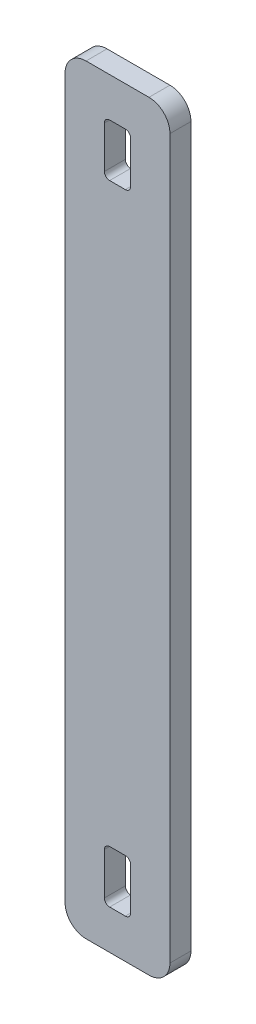
ISO-10303-21;
HEADER;
FILE_DESCRIPTION(('STEP AP214'),'2;1');
FILE_NAME('part.step','',(''),(''),'','','');
FILE_SCHEMA(('AUTOMOTIVE_DESIGN { 1 0 10303 214 1 1 1 1 }'));
ENDSEC;
DATA;
#1=APPLICATION_CONTEXT('core data for automotive mechanical design processes');
#2=APPLICATION_PROTOCOL_DEFINITION('international standard','automotive_design',2000,#1);
#3=PRODUCT_CONTEXT('',#1,'mechanical');
#4=PRODUCT('Part','Part','',(#3));
#5=PRODUCT_RELATED_PRODUCT_CATEGORY('part','',(#4));
#6=PRODUCT_DEFINITION_FORMATION('','',#4);
#7=PRODUCT_DEFINITION_CONTEXT('part definition',#1,'design');
#8=PRODUCT_DEFINITION('design','',#6,#7);
#9=PRODUCT_DEFINITION_SHAPE('','',#8);
#10=(LENGTH_UNIT() NAMED_UNIT(*) SI_UNIT(.MILLI.,.METRE.));
#11=(NAMED_UNIT(*) PLANE_ANGLE_UNIT() SI_UNIT($,.RADIAN.));
#12=(NAMED_UNIT(*) SI_UNIT($,.STERADIAN.) SOLID_ANGLE_UNIT());
#13=UNCERTAINTY_MEASURE_WITH_UNIT(LENGTH_MEASURE(1.E-05),#10,'distance_accuracy_value','');
#14=(GEOMETRIC_REPRESENTATION_CONTEXT(3) GLOBAL_UNCERTAINTY_ASSIGNED_CONTEXT((#13)) GLOBAL_UNIT_ASSIGNED_CONTEXT((#10,
#11,#12)) REPRESENTATION_CONTEXT('',''));
#15=CARTESIAN_POINT('',(0.,0.,0.));
#16=DIRECTION('',(0.,0.,1.));
#17=DIRECTION('',(1.,0.,0.));
#18=AXIS2_PLACEMENT_3D('',#15,#16,#17);
#19=CARTESIAN_POINT('',(-6.,-68.5,4.));
#20=DIRECTION('',(0.,0.,-1.));
#21=DIRECTION('',(-1.,0.,0.));
#22=AXIS2_PLACEMENT_3D('',#19,#20,#21);
#23=CYLINDRICAL_SURFACE('',#22,4.);
#24=CARTESIAN_POINT('',(-6.,-68.5,0.));
#25=DIRECTION('',(0.,0.,1.));
#26=DIRECTION('',(-1.,0.,0.));
#27=AXIS2_PLACEMENT_3D('',#24,#25,#26);
#28=CIRCLE('',#27,4.);
#29=CARTESIAN_POINT('',(-10.,-68.5,0.));
#30=VERTEX_POINT('',#29);
#31=CARTESIAN_POINT('',(-6.,-72.5,0.));
#32=VERTEX_POINT('',#31);
#33=EDGE_CURVE('E256',#30,#32,#28,.T.);
#34=ORIENTED_EDGE('',*,*,#33,.T.);
#35=DIRECTION('',(0.,0.,-1.));
#36=VECTOR('',#35,1.);
#37=CARTESIAN_POINT('',(-6.,-72.5,4.));
#38=LINE('',#37,#36);
#39=CARTESIAN_POINT('',(-6.,-72.5,4.));
#40=VERTEX_POINT('',#39);
#41=EDGE_CURVE('E11',#40,#32,#38,.T.);
#42=ORIENTED_EDGE('',*,*,#41,.F.);
#43=CARTESIAN_POINT('',(-6.,-68.5,4.));
#44=DIRECTION('',(0.,0.,1.));
#45=DIRECTION('',(-1.,0.,0.));
#46=AXIS2_PLACEMENT_3D('',#43,#44,#45);
#47=CIRCLE('',#46,4.);
#48=CARTESIAN_POINT('',(-10.,-68.5,4.));
#49=VERTEX_POINT('',#48);
#50=EDGE_CURVE('E329',#49,#40,#47,.T.);
#51=ORIENTED_EDGE('',*,*,#50,.F.);
#52=DIRECTION('',(0.,0.,-1.));
#53=VECTOR('',#52,1.);
#54=CARTESIAN_POINT('',(-10.,-68.5,4.));
#55=LINE('',#54,#53);
#56=EDGE_CURVE('E347',#49,#30,#55,.T.);
#57=ORIENTED_EDGE('',*,*,#56,.T.);
#58=EDGE_LOOP('',(#34,#42,#51,#57));
#59=FACE_BOUND('',#58,.T.);
#60=ADVANCED_FACE('F35',(#59),#23,.T.);
#61=CARTESIAN_POINT('',(-6.,-72.5,4.));
#62=DIRECTION('',(0.,1.,0.));
#63=DIRECTION('',(0.,0.,1.));
#64=AXIS2_PLACEMENT_3D('',#61,#62,#63);
#65=PLANE('',#64);
#66=DIRECTION('',(1.,0.,0.));
#67=VECTOR('',#66,1.);
#68=CARTESIAN_POINT('',(-6.,-72.5,0.));
#69=LINE('',#68,#67);
#70=CARTESIAN_POINT('',(6.,-72.5,0.));
#71=VERTEX_POINT('',#70);
#72=EDGE_CURVE('E350',#32,#71,#69,.T.);
#73=ORIENTED_EDGE('',*,*,#72,.T.);
#74=DIRECTION('',(0.,0.,-1.));
#75=VECTOR('',#74,1.);
#76=CARTESIAN_POINT('',(6.,-72.5,4.));
#77=LINE('',#76,#75);
#78=CARTESIAN_POINT('',(6.,-72.5,4.));
#79=VERTEX_POINT('',#78);
#80=EDGE_CURVE('E42',#79,#71,#77,.T.);
#81=ORIENTED_EDGE('',*,*,#80,.F.);
#82=DIRECTION('',(1.,0.,0.));
#83=VECTOR('',#82,1.);
#84=CARTESIAN_POINT('',(-6.,-72.5,4.));
#85=LINE('',#84,#83);
#86=EDGE_CURVE('E332',#40,#79,#85,.T.);
#87=ORIENTED_EDGE('',*,*,#86,.F.);
#88=ORIENTED_EDGE('',*,*,#41,.T.);
#89=EDGE_LOOP('',(#73,#81,#87,#88));
#90=FACE_BOUND('',#89,.T.);
#91=ADVANCED_FACE('F406',(#90),#65,.F.);
#92=CARTESIAN_POINT('',(6.,-68.5,4.));
#93=DIRECTION('',(0.,0.,-1.));
#94=DIRECTION('',(-1.,0.,0.));
#95=AXIS2_PLACEMENT_3D('',#92,#93,#94);
#96=CYLINDRICAL_SURFACE('',#95,4.);
#97=CARTESIAN_POINT('',(6.,-68.5,0.));
#98=DIRECTION('',(0.,0.,1.));
#99=DIRECTION('',(1.,0.,0.));
#100=AXIS2_PLACEMENT_3D('',#97,#98,#99);
#101=CIRCLE('',#100,4.);
#102=CARTESIAN_POINT('',(10.,-68.5,0.));
#103=VERTEX_POINT('',#102);
#104=EDGE_CURVE('E352',#71,#103,#101,.T.);
#105=ORIENTED_EDGE('',*,*,#104,.T.);
#106=DIRECTION('',(0.,0.,-1.));
#107=VECTOR('',#106,1.);
#108=CARTESIAN_POINT('',(10.,-68.5,4.));
#109=LINE('',#108,#107);
#110=CARTESIAN_POINT('',(10.,-68.5,4.));
#111=VERTEX_POINT('',#110);
#112=EDGE_CURVE('E377',#111,#103,#109,.T.);
#113=ORIENTED_EDGE('',*,*,#112,.F.);
#114=CARTESIAN_POINT('',(6.,-68.5,4.));
#115=DIRECTION('',(0.,0.,1.));
#116=DIRECTION('',(1.,0.,0.));
#117=AXIS2_PLACEMENT_3D('',#114,#115,#116);
#118=CIRCLE('',#117,4.);
#119=EDGE_CURVE('E335',#79,#111,#118,.T.);
#120=ORIENTED_EDGE('',*,*,#119,.F.);
#121=ORIENTED_EDGE('',*,*,#80,.T.);
#122=EDGE_LOOP('',(#105,#113,#120,#121));
#123=FACE_BOUND('',#122,.T.);
#124=ADVANCED_FACE('F384',(#123),#96,.T.);
#125=CARTESIAN_POINT('',(10.,-68.5,4.));
#126=DIRECTION('',(-1.,0.,0.));
#127=DIRECTION('',(0.,0.,1.));
#128=AXIS2_PLACEMENT_3D('',#125,#126,#127);
#129=PLANE('',#128);
#130=DIRECTION('',(0.,1.,0.));
#131=VECTOR('',#130,1.);
#132=CARTESIAN_POINT('',(10.,-68.5,0.));
#133=LINE('',#132,#131);
#134=CARTESIAN_POINT('',(10.,68.5,0.));
#135=VERTEX_POINT('',#134);
#136=EDGE_CURVE('E354',#103,#135,#133,.T.);
#137=ORIENTED_EDGE('',*,*,#136,.T.);
#138=DIRECTION('',(0.,0.,-1.));
#139=VECTOR('',#138,1.);
#140=CARTESIAN_POINT('',(10.,68.5,4.));
#141=LINE('',#140,#139);
#142=CARTESIAN_POINT('',(10.,68.5,4.));
#143=VERTEX_POINT('',#142);
#144=EDGE_CURVE('E374',#143,#135,#141,.T.);
#145=ORIENTED_EDGE('',*,*,#144,.F.);
#146=DIRECTION('',(0.,1.,0.));
#147=VECTOR('',#146,1.);
#148=CARTESIAN_POINT('',(10.,-68.5,4.));
#149=LINE('',#148,#147);
#150=EDGE_CURVE('E337',#111,#143,#149,.T.);
#151=ORIENTED_EDGE('',*,*,#150,.F.);
#152=ORIENTED_EDGE('',*,*,#112,.T.);
#153=EDGE_LOOP('',(#137,#145,#151,#152));
#154=FACE_BOUND('',#153,.T.);
#155=ADVANCED_FACE('F394',(#154),#129,.F.);
#156=CARTESIAN_POINT('',(6.,68.5,4.));
#157=DIRECTION('',(0.,0.,-1.));
#158=DIRECTION('',(-1.,0.,0.));
#159=AXIS2_PLACEMENT_3D('',#156,#157,#158);
#160=CYLINDRICAL_SURFACE('',#159,4.);
#161=CARTESIAN_POINT('',(6.,68.5,0.));
#162=DIRECTION('',(0.,0.,1.));
#163=DIRECTION('',(-1.,0.,0.));
#164=AXIS2_PLACEMENT_3D('',#161,#162,#163);
#165=CIRCLE('',#164,4.);
#166=CARTESIAN_POINT('',(6.,72.5,0.));
#167=VERTEX_POINT('',#166);
#168=EDGE_CURVE('E356',#135,#167,#165,.T.);
#169=ORIENTED_EDGE('',*,*,#168,.T.);
#170=DIRECTION('',(0.,0.,-1.));
#171=VECTOR('',#170,1.);
#172=CARTESIAN_POINT('',(6.,72.5,4.));
#173=LINE('',#172,#171);
#174=CARTESIAN_POINT('',(6.,72.5,4.));
#175=VERTEX_POINT('',#174);
#176=EDGE_CURVE('E371',#175,#167,#173,.T.);
#177=ORIENTED_EDGE('',*,*,#176,.F.);
#178=CARTESIAN_POINT('',(6.,68.5,4.));
#179=DIRECTION('',(0.,0.,1.));
#180=DIRECTION('',(-1.,0.,0.));
#181=AXIS2_PLACEMENT_3D('',#178,#179,#180);
#182=CIRCLE('',#181,4.);
#183=EDGE_CURVE('E339',#143,#175,#182,.T.);
#184=ORIENTED_EDGE('',*,*,#183,.F.);
#185=ORIENTED_EDGE('',*,*,#144,.T.);
#186=EDGE_LOOP('',(#169,#177,#184,#185));
#187=FACE_BOUND('',#186,.T.);
#188=ADVANCED_FACE('F398',(#187),#160,.T.);
#189=CARTESIAN_POINT('',(-6.,72.5,4.));
#190=DIRECTION('',(0.,-1.,0.));
#191=DIRECTION('',(0.,0.,-1.));
#192=AXIS2_PLACEMENT_3D('',#189,#190,#191);
#193=PLANE('',#192);
#194=DIRECTION('',(-1.,0.,0.));
#195=VECTOR('',#194,1.);
#196=CARTESIAN_POINT('',(-6.,72.5,0.));
#197=LINE('',#196,#195);
#198=CARTESIAN_POINT('',(-6.,72.5,0.));
#199=VERTEX_POINT('',#198);
#200=EDGE_CURVE('E358',#167,#199,#197,.T.);
#201=ORIENTED_EDGE('',*,*,#200,.T.);
#202=DIRECTION('',(0.,0.,-1.));
#203=VECTOR('',#202,1.);
#204=CARTESIAN_POINT('',(-6.,72.5,4.));
#205=LINE('',#204,#203);
#206=CARTESIAN_POINT('',(-6.,72.5,4.));
#207=VERTEX_POINT('',#206);
#208=EDGE_CURVE('E368',#207,#199,#205,.T.);
#209=ORIENTED_EDGE('',*,*,#208,.F.);
#210=DIRECTION('',(-1.,0.,0.));
#211=VECTOR('',#210,1.);
#212=CARTESIAN_POINT('',(-6.,72.5,4.));
#213=LINE('',#212,#211);
#214=EDGE_CURVE('E341',#175,#207,#213,.T.);
#215=ORIENTED_EDGE('',*,*,#214,.F.);
#216=ORIENTED_EDGE('',*,*,#176,.T.);
#217=EDGE_LOOP('',(#201,#209,#215,#216));
#218=FACE_BOUND('',#217,.T.);
#219=ADVANCED_FACE('F419',(#218),#193,.F.);
#220=CARTESIAN_POINT('',(-6.,68.5,4.));
#221=DIRECTION('',(0.,0.,-1.));
#222=DIRECTION('',(-1.,0.,0.));
#223=AXIS2_PLACEMENT_3D('',#220,#221,#222);
#224=CYLINDRICAL_SURFACE('',#223,4.);
#225=CARTESIAN_POINT('',(-6.,68.5,0.));
#226=DIRECTION('',(0.,0.,1.));
#227=DIRECTION('',(-1.,0.,0.));
#228=AXIS2_PLACEMENT_3D('',#225,#226,#227);
#229=CIRCLE('',#228,4.);
#230=CARTESIAN_POINT('',(-10.,68.5,0.));
#231=VERTEX_POINT('',#230);
#232=EDGE_CURVE('E360',#199,#231,#229,.T.);
#233=ORIENTED_EDGE('',*,*,#232,.T.);
#234=DIRECTION('',(0.,0.,-1.));
#235=VECTOR('',#234,1.);
#236=CARTESIAN_POINT('',(-10.,68.5,4.));
#237=LINE('',#236,#235);
#238=CARTESIAN_POINT('',(-10.,68.5,4.));
#239=VERTEX_POINT('',#238);
#240=EDGE_CURVE('E365',#239,#231,#237,.T.);
#241=ORIENTED_EDGE('',*,*,#240,.F.);
#242=CARTESIAN_POINT('',(-6.,68.5,4.));
#243=DIRECTION('',(0.,0.,1.));
#244=DIRECTION('',(-1.,0.,0.));
#245=AXIS2_PLACEMENT_3D('',#242,#243,#244);
#246=CIRCLE('',#245,4.);
#247=EDGE_CURVE('E343',#207,#239,#246,.T.);
#248=ORIENTED_EDGE('',*,*,#247,.F.);
#249=ORIENTED_EDGE('',*,*,#208,.T.);
#250=EDGE_LOOP('',(#233,#241,#248,#249));
#251=FACE_BOUND('',#250,.T.);
#252=ADVANCED_FACE('F417',(#251),#224,.T.);
#253=CARTESIAN_POINT('',(-10.,-68.5,4.));
#254=DIRECTION('',(1.,0.,0.));
#255=DIRECTION('',(0.,0.,-1.));
#256=AXIS2_PLACEMENT_3D('',#253,#254,#255);
#257=PLANE('',#256);
#258=DIRECTION('',(0.,-1.,0.));
#259=VECTOR('',#258,1.);
#260=CARTESIAN_POINT('',(-10.,-68.5,0.));
#261=LINE('',#260,#259);
#262=EDGE_CURVE('E333',#231,#30,#261,.T.);
#263=ORIENTED_EDGE('',*,*,#262,.T.);
#264=ORIENTED_EDGE('',*,*,#56,.F.);
#265=DIRECTION('',(0.,-1.,0.));
#266=VECTOR('',#265,1.);
#267=CARTESIAN_POINT('',(-10.,-68.5,4.));
#268=LINE('',#267,#266);
#269=EDGE_CURVE('E345',#239,#49,#268,.T.);
#270=ORIENTED_EDGE('',*,*,#269,.F.);
#271=ORIENTED_EDGE('',*,*,#240,.T.);
#272=EDGE_LOOP('',(#263,#264,#270,#271));
#273=FACE_BOUND('',#272,.T.);
#274=ADVANCED_FACE('F412',(#273),#257,.F.);
#275=CARTESIAN_POINT('',(-6.,-68.5,4.));
#276=DIRECTION('',(0.,0.,-1.));
#277=DIRECTION('',(-1.,0.,0.));
#278=AXIS2_PLACEMENT_3D('',#275,#276,#277);
#279=PLANE('',#278);
#280=DIRECTION('',(1.,0.,0.));
#281=VECTOR('',#280,1.);
#282=CARTESIAN_POINT('',(-1.50000000000003,55.,4.));
#283=LINE('',#282,#281);
#284=CARTESIAN_POINT('',(-1.50000000000003,55.,4.));
#285=VERTEX_POINT('',#284);
#286=CARTESIAN_POINT('',(1.49999999999997,55.,4.));
#287=VERTEX_POINT('',#286);
#288=EDGE_CURVE('E237',#285,#287,#283,.T.);
#289=ORIENTED_EDGE('',*,*,#288,.F.);
#290=CARTESIAN_POINT('',(-1.50000000000003,56.,4.));
#291=DIRECTION('',(0.,0.,1.));
#292=DIRECTION('',(1.,0.,0.));
#293=AXIS2_PLACEMENT_3D('',#290,#291,#292);
#294=CIRCLE('',#293,0.999999999999997);
#295=CARTESIAN_POINT('',(-2.50000000000003,56.,4.));
#296=VERTEX_POINT('',#295);
#297=EDGE_CURVE('E49',#296,#285,#294,.T.);
#298=ORIENTED_EDGE('',*,*,#297,.F.);
#299=DIRECTION('',(0.,-1.,0.));
#300=VECTOR('',#299,1.);
#301=CARTESIAN_POINT('',(-2.50000000000003,56.,4.));
#302=LINE('',#301,#300);
#303=CARTESIAN_POINT('',(-2.50000000000003,64.,4.));
#304=VERTEX_POINT('',#303);
#305=EDGE_CURVE('E217',#304,#296,#302,.T.);
#306=ORIENTED_EDGE('',*,*,#305,.F.);
#307=CARTESIAN_POINT('',(-1.50000000000003,64.,4.));
#308=DIRECTION('',(0.,0.,1.));
#309=DIRECTION('',(-1.,0.,0.));
#310=AXIS2_PLACEMENT_3D('',#307,#308,#309);
#311=CIRCLE('',#310,1.);
#312=CARTESIAN_POINT('',(-1.50000000000003,65.,4.));
#313=VERTEX_POINT('',#312);
#314=EDGE_CURVE('E220',#313,#304,#311,.T.);
#315=ORIENTED_EDGE('',*,*,#314,.F.);
#316=DIRECTION('',(-1.,0.,0.));
#317=VECTOR('',#316,1.);
#318=CARTESIAN_POINT('',(-1.50000000000003,65.,4.));
#319=LINE('',#318,#317);
#320=CARTESIAN_POINT('',(1.49999999999997,65.,4.));
#321=VERTEX_POINT('',#320);
#322=EDGE_CURVE('E249',#321,#313,#319,.T.);
#323=ORIENTED_EDGE('',*,*,#322,.F.);
#324=CARTESIAN_POINT('',(1.49999999999997,64.,4.));
#325=DIRECTION('',(0.,0.,1.));
#326=DIRECTION('',(1.,0.,0.));
#327=AXIS2_PLACEMENT_3D('',#324,#325,#326);
#328=CIRCLE('',#327,1.);
#329=CARTESIAN_POINT('',(2.49999999999997,64.,4.));
#330=VERTEX_POINT('',#329);
#331=EDGE_CURVE('E246',#330,#321,#328,.T.);
#332=ORIENTED_EDGE('',*,*,#331,.F.);
#333=DIRECTION('',(0.,1.,0.));
#334=VECTOR('',#333,1.);
#335=CARTESIAN_POINT('',(2.49999999999997,56.,4.));
#336=LINE('',#335,#334);
#337=CARTESIAN_POINT('',(2.49999999999997,56.,4.));
#338=VERTEX_POINT('',#337);
#339=EDGE_CURVE('E243',#338,#330,#336,.T.);
#340=ORIENTED_EDGE('',*,*,#339,.F.);
#341=CARTESIAN_POINT('',(1.49999999999997,56.,4.));
#342=DIRECTION('',(0.,0.,1.));
#343=DIRECTION('',(1.,0.,0.));
#344=AXIS2_PLACEMENT_3D('',#341,#342,#343);
#345=CIRCLE('',#344,0.999999999999997);
#346=EDGE_CURVE('E240',#287,#338,#345,.T.);
#347=ORIENTED_EDGE('',*,*,#346,.F.);
#348=EDGE_LOOP('',(#289,#298,#306,#315,#323,#332,#340,#347));
#349=FACE_BOUND('',#348,.T.);
#350=DIRECTION('',(1.,0.,0.));
#351=VECTOR('',#350,1.);
#352=CARTESIAN_POINT('',(-1.49999999999998,-65.,4.));
#353=LINE('',#352,#351);
#354=CARTESIAN_POINT('',(-1.49999999999998,-65.,4.));
#355=VERTEX_POINT('',#354);
#356=CARTESIAN_POINT('',(1.50000000000002,-65.,4.));
#357=VERTEX_POINT('',#356);
#358=EDGE_CURVE('E295',#355,#357,#353,.T.);
#359=ORIENTED_EDGE('',*,*,#358,.F.);
#360=CARTESIAN_POINT('',(-1.49999999999998,-64.,4.));
#361=DIRECTION('',(0.,0.,1.));
#362=DIRECTION('',(1.,0.,0.));
#363=AXIS2_PLACEMENT_3D('',#360,#361,#362);
#364=CIRCLE('',#363,1.);
#365=CARTESIAN_POINT('',(-2.49999999999998,-64.,4.));
#366=VERTEX_POINT('',#365);
#367=EDGE_CURVE('E57',#366,#355,#364,.T.);
#368=ORIENTED_EDGE('',*,*,#367,.F.);
#369=DIRECTION('',(0.,-1.,0.));
#370=VECTOR('',#369,1.);
#371=CARTESIAN_POINT('',(-2.49999999999998,-64.,4.));
#372=LINE('',#371,#370);
#373=CARTESIAN_POINT('',(-2.50000000000002,-56.,4.));
#374=VERTEX_POINT('',#373);
#375=EDGE_CURVE('E272',#374,#366,#372,.T.);
#376=ORIENTED_EDGE('',*,*,#375,.F.);
#377=CARTESIAN_POINT('',(-1.50000000000001,-56.,4.));
#378=DIRECTION('',(0.,0.,1.));
#379=DIRECTION('',(-1.,0.,0.));
#380=AXIS2_PLACEMENT_3D('',#377,#378,#379);
#381=CIRCLE('',#380,1.);
#382=CARTESIAN_POINT('',(-1.50000000000002,-55.,4.));
#383=VERTEX_POINT('',#382);
#384=EDGE_CURVE('E310',#383,#374,#381,.T.);
#385=ORIENTED_EDGE('',*,*,#384,.F.);
#386=DIRECTION('',(-1.,0.,0.));
#387=VECTOR('',#386,1.);
#388=CARTESIAN_POINT('',(-1.50000000000002,-55.,4.));
#389=LINE('',#388,#387);
#390=CARTESIAN_POINT('',(1.50000000000003,-55.,4.));
#391=VERTEX_POINT('',#390);
#392=EDGE_CURVE('E307',#391,#383,#389,.T.);
#393=ORIENTED_EDGE('',*,*,#392,.F.);
#394=CARTESIAN_POINT('',(1.50000000000001,-56.,4.));
#395=DIRECTION('',(0.,0.,1.));
#396=DIRECTION('',(1.,0.,0.));
#397=AXIS2_PLACEMENT_3D('',#394,#395,#396);
#398=CIRCLE('',#397,1.00000000000001);
#399=CARTESIAN_POINT('',(2.50000000000002,-56.,4.));
#400=VERTEX_POINT('',#399);
#401=EDGE_CURVE('E304',#400,#391,#398,.T.);
#402=ORIENTED_EDGE('',*,*,#401,.F.);
#403=DIRECTION('',(0.,1.,0.));
#404=VECTOR('',#403,1.);
#405=CARTESIAN_POINT('',(2.50000000000003,-64.,4.));
#406=LINE('',#405,#404);
#407=CARTESIAN_POINT('',(2.50000000000003,-64.,4.));
#408=VERTEX_POINT('',#407);
#409=EDGE_CURVE('E301',#408,#400,#406,.T.);
#410=ORIENTED_EDGE('',*,*,#409,.F.);
#411=CARTESIAN_POINT('',(1.50000000000002,-64.,4.));
#412=DIRECTION('',(0.,0.,1.));
#413=DIRECTION('',(1.,0.,0.));
#414=AXIS2_PLACEMENT_3D('',#411,#412,#413);
#415=CIRCLE('',#414,1.00000000000001);
#416=EDGE_CURVE('E298',#357,#408,#415,.T.);
#417=ORIENTED_EDGE('',*,*,#416,.F.);
#418=EDGE_LOOP('',(#359,#368,#376,#385,#393,#402,#410,#417));
#419=FACE_BOUND('',#418,.T.);
#420=ORIENTED_EDGE('',*,*,#50,.T.);
#421=ORIENTED_EDGE('',*,*,#86,.T.);
#422=ORIENTED_EDGE('',*,*,#119,.T.);
#423=ORIENTED_EDGE('',*,*,#150,.T.);
#424=ORIENTED_EDGE('',*,*,#183,.T.);
#425=ORIENTED_EDGE('',*,*,#214,.T.);
#426=ORIENTED_EDGE('',*,*,#247,.T.);
#427=ORIENTED_EDGE('',*,*,#269,.T.);
#428=EDGE_LOOP('',(#420,#421,#422,#423,#424,#425,#426,#427));
#429=FACE_BOUND('',#428,.T.);
#430=ADVANCED_FACE('F402',(#349,#419,#429),#279,.F.);
#431=CARTESIAN_POINT('',(-6.,-68.5,0.));
#432=DIRECTION('',(0.,0.,-1.));
#433=DIRECTION('',(-1.,0.,0.));
#434=AXIS2_PLACEMENT_3D('',#431,#432,#433);
#435=PLANE('',#434);
#436=CARTESIAN_POINT('',(-1.50000000000003,56.,0.));
#437=DIRECTION('',(0.,0.,1.));
#438=DIRECTION('',(1.,0.,0.));
#439=AXIS2_PLACEMENT_3D('',#436,#437,#438);
#440=CIRCLE('',#439,0.999999999999997);
#441=CARTESIAN_POINT('',(-2.50000000000003,56.,0.));
#442=VERTEX_POINT('',#441);
#443=CARTESIAN_POINT('',(-1.50000000000003,55.,0.));
#444=VERTEX_POINT('',#443);
#445=EDGE_CURVE('E197',#442,#444,#440,.T.);
#446=ORIENTED_EDGE('',*,*,#445,.T.);
#447=DIRECTION('',(1.,0.,0.));
#448=VECTOR('',#447,1.);
#449=CARTESIAN_POINT('',(-1.50000000000003,55.,0.));
#450=LINE('',#449,#448);
#451=CARTESIAN_POINT('',(1.49999999999997,55.,0.));
#452=VERTEX_POINT('',#451);
#453=EDGE_CURVE('E207',#444,#452,#450,.T.);
#454=ORIENTED_EDGE('',*,*,#453,.T.);
#455=CARTESIAN_POINT('',(1.49999999999997,56.,0.));
#456=DIRECTION('',(0.,0.,1.));
#457=DIRECTION('',(1.,0.,0.));
#458=AXIS2_PLACEMENT_3D('',#455,#456,#457);
#459=CIRCLE('',#458,0.999999999999997);
#460=CARTESIAN_POINT('',(2.49999999999997,56.,0.));
#461=VERTEX_POINT('',#460);
#462=EDGE_CURVE('E211',#452,#461,#459,.T.);
#463=ORIENTED_EDGE('',*,*,#462,.T.);
#464=DIRECTION('',(0.,1.,0.));
#465=VECTOR('',#464,1.);
#466=CARTESIAN_POINT('',(2.49999999999997,56.,0.));
#467=LINE('',#466,#465);
#468=CARTESIAN_POINT('',(2.49999999999997,64.,0.));
#469=VERTEX_POINT('',#468);
#470=EDGE_CURVE('E224',#461,#469,#467,.T.);
#471=ORIENTED_EDGE('',*,*,#470,.T.);
#472=CARTESIAN_POINT('',(1.49999999999997,64.,0.));
#473=DIRECTION('',(0.,0.,1.));
#474=DIRECTION('',(1.,0.,0.));
#475=AXIS2_PLACEMENT_3D('',#472,#473,#474);
#476=CIRCLE('',#475,1.);
#477=CARTESIAN_POINT('',(1.49999999999997,65.,0.));
#478=VERTEX_POINT('',#477);
#479=EDGE_CURVE('E227',#469,#478,#476,.T.);
#480=ORIENTED_EDGE('',*,*,#479,.T.);
#481=DIRECTION('',(-1.,0.,0.));
#482=VECTOR('',#481,1.);
#483=CARTESIAN_POINT('',(-1.50000000000003,65.,0.));
#484=LINE('',#483,#482);
#485=CARTESIAN_POINT('',(-1.50000000000003,65.,0.));
#486=VERTEX_POINT('',#485);
#487=EDGE_CURVE('E230',#478,#486,#484,.T.);
#488=ORIENTED_EDGE('',*,*,#487,.T.);
#489=CARTESIAN_POINT('',(-1.50000000000003,64.,0.));
#490=DIRECTION('',(0.,0.,1.));
#491=DIRECTION('',(-1.,0.,0.));
#492=AXIS2_PLACEMENT_3D('',#489,#490,#491);
#493=CIRCLE('',#492,1.);
#494=CARTESIAN_POINT('',(-2.50000000000003,64.,0.));
#495=VERTEX_POINT('',#494);
#496=EDGE_CURVE('E233',#486,#495,#493,.T.);
#497=ORIENTED_EDGE('',*,*,#496,.T.);
#498=DIRECTION('',(0.,-1.,0.));
#499=VECTOR('',#498,1.);
#500=CARTESIAN_POINT('',(-2.50000000000003,56.,0.));
#501=LINE('',#500,#499);
#502=EDGE_CURVE('E203',#495,#442,#501,.T.);
#503=ORIENTED_EDGE('',*,*,#502,.T.);
#504=EDGE_LOOP('',(#446,#454,#463,#471,#480,#488,#497,#503));
#505=FACE_BOUND('',#504,.T.);
#506=CARTESIAN_POINT('',(-1.49999999999998,-64.,0.));
#507=DIRECTION('',(0.,0.,1.));
#508=DIRECTION('',(1.,0.,0.));
#509=AXIS2_PLACEMENT_3D('',#506,#507,#508);
#510=CIRCLE('',#509,1.);
#511=CARTESIAN_POINT('',(-2.49999999999998,-64.,0.));
#512=VERTEX_POINT('',#511);
#513=CARTESIAN_POINT('',(-1.49999999999998,-65.,0.));
#514=VERTEX_POINT('',#513);
#515=EDGE_CURVE('E268',#512,#514,#510,.T.);
#516=ORIENTED_EDGE('',*,*,#515,.T.);
#517=DIRECTION('',(1.,0.,0.));
#518=VECTOR('',#517,1.);
#519=CARTESIAN_POINT('',(-1.49999999999998,-65.,0.));
#520=LINE('',#519,#518);
#521=CARTESIAN_POINT('',(1.50000000000002,-65.,0.));
#522=VERTEX_POINT('',#521);
#523=EDGE_CURVE('E271',#514,#522,#520,.T.);
#524=ORIENTED_EDGE('',*,*,#523,.T.);
#525=CARTESIAN_POINT('',(1.50000000000002,-64.,0.));
#526=DIRECTION('',(0.,0.,1.));
#527=DIRECTION('',(1.,0.,0.));
#528=AXIS2_PLACEMENT_3D('',#525,#526,#527);
#529=CIRCLE('',#528,1.00000000000001);
#530=CARTESIAN_POINT('',(2.50000000000003,-64.,0.));
#531=VERTEX_POINT('',#530);
#532=EDGE_CURVE('E275',#522,#531,#529,.T.);
#533=ORIENTED_EDGE('',*,*,#532,.T.);
#534=DIRECTION('',(0.,1.,0.));
#535=VECTOR('',#534,1.);
#536=CARTESIAN_POINT('',(2.50000000000003,-64.,0.));
#537=LINE('',#536,#535);
#538=CARTESIAN_POINT('',(2.50000000000002,-56.,0.));
#539=VERTEX_POINT('',#538);
#540=EDGE_CURVE('E278',#531,#539,#537,.T.);
#541=ORIENTED_EDGE('',*,*,#540,.T.);
#542=CARTESIAN_POINT('',(1.50000000000001,-56.,0.));
#543=DIRECTION('',(0.,0.,1.));
#544=DIRECTION('',(1.,0.,0.));
#545=AXIS2_PLACEMENT_3D('',#542,#543,#544);
#546=CIRCLE('',#545,1.00000000000001);
#547=CARTESIAN_POINT('',(1.50000000000003,-55.,0.));
#548=VERTEX_POINT('',#547);
#549=EDGE_CURVE('E281',#539,#548,#546,.T.);
#550=ORIENTED_EDGE('',*,*,#549,.T.);
#551=DIRECTION('',(-1.,0.,0.));
#552=VECTOR('',#551,1.);
#553=CARTESIAN_POINT('',(-1.50000000000002,-55.,0.));
#554=LINE('',#553,#552);
#555=CARTESIAN_POINT('',(-1.50000000000002,-55.,0.));
#556=VERTEX_POINT('',#555);
#557=EDGE_CURVE('E284',#548,#556,#554,.T.);
#558=ORIENTED_EDGE('',*,*,#557,.T.);
#559=CARTESIAN_POINT('',(-1.50000000000001,-56.,0.));
#560=DIRECTION('',(0.,0.,1.));
#561=DIRECTION('',(-1.,0.,0.));
#562=AXIS2_PLACEMENT_3D('',#559,#560,#561);
#563=CIRCLE('',#562,1.);
#564=CARTESIAN_POINT('',(-2.50000000000002,-56.,0.));
#565=VERTEX_POINT('',#564);
#566=EDGE_CURVE('E287',#556,#565,#563,.T.);
#567=ORIENTED_EDGE('',*,*,#566,.T.);
#568=DIRECTION('',(0.,-1.,0.));
#569=VECTOR('',#568,1.);
#570=CARTESIAN_POINT('',(-2.49999999999998,-64.,0.));
#571=LINE('',#570,#569);
#572=EDGE_CURVE('E290',#565,#512,#571,.T.);
#573=ORIENTED_EDGE('',*,*,#572,.T.);
#574=EDGE_LOOP('',(#516,#524,#533,#541,#550,#558,#567,#573));
#575=FACE_BOUND('',#574,.T.);
#576=ORIENTED_EDGE('',*,*,#33,.F.);
#577=ORIENTED_EDGE('',*,*,#262,.F.);
#578=ORIENTED_EDGE('',*,*,#232,.F.);
#579=ORIENTED_EDGE('',*,*,#200,.F.);
#580=ORIENTED_EDGE('',*,*,#168,.F.);
#581=ORIENTED_EDGE('',*,*,#136,.F.);
#582=ORIENTED_EDGE('',*,*,#104,.F.);
#583=ORIENTED_EDGE('',*,*,#72,.F.);
#584=EDGE_LOOP('',(#576,#577,#578,#579,#580,#581,#582,#583));
#585=FACE_BOUND('',#584,.T.);
#586=ADVANCED_FACE('F213',(#505,#575,#585),#435,.T.);
#587=CARTESIAN_POINT('',(-1.49999999999998,-64.,0.));
#588=DIRECTION('',(0.,0.,1.));
#589=DIRECTION('',(1.,0.,0.));
#590=AXIS2_PLACEMENT_3D('',#587,#588,#589);
#591=CYLINDRICAL_SURFACE('',#590,1.);
#592=ORIENTED_EDGE('',*,*,#367,.T.);
#593=DIRECTION('',(0.,0.,1.));
#594=VECTOR('',#593,1.);
#595=CARTESIAN_POINT('',(-1.49999999999998,-65.,0.));
#596=LINE('',#595,#594);
#597=EDGE_CURVE('E293',#514,#355,#596,.T.);
#598=ORIENTED_EDGE('',*,*,#597,.F.);
#599=ORIENTED_EDGE('',*,*,#515,.F.);
#600=DIRECTION('',(0.,0.,1.));
#601=VECTOR('',#600,1.);
#602=CARTESIAN_POINT('',(-2.49999999999998,-64.,0.));
#603=LINE('',#602,#601);
#604=EDGE_CURVE('E238',#512,#366,#603,.T.);
#605=ORIENTED_EDGE('',*,*,#604,.T.);
#606=EDGE_LOOP('',(#592,#598,#599,#605));
#607=FACE_BOUND('',#606,.T.);
#608=ADVANCED_FACE('F482',(#607),#591,.F.);
#609=CARTESIAN_POINT('',(-2.49999999999998,-64.,0.));
#610=DIRECTION('',(-1.,0.,0.));
#611=DIRECTION('',(0.,-1.,0.));
#612=AXIS2_PLACEMENT_3D('',#609,#610,#611);
#613=PLANE('',#612);
#614=ORIENTED_EDGE('',*,*,#375,.T.);
#615=ORIENTED_EDGE('',*,*,#604,.F.);
#616=ORIENTED_EDGE('',*,*,#572,.F.);
#617=DIRECTION('',(0.,0.,1.));
#618=VECTOR('',#617,1.);
#619=CARTESIAN_POINT('',(-2.50000000000002,-56.,0.));
#620=LINE('',#619,#618);
#621=EDGE_CURVE('E316',#565,#374,#620,.T.);
#622=ORIENTED_EDGE('',*,*,#621,.T.);
#623=EDGE_LOOP('',(#614,#615,#616,#622));
#624=FACE_BOUND('',#623,.T.);
#625=ADVANCED_FACE('F491',(#624),#613,.F.);
#626=CARTESIAN_POINT('',(-1.50000000000001,-56.,0.));
#627=DIRECTION('',(0.,0.,1.));
#628=DIRECTION('',(1.,0.,0.));
#629=AXIS2_PLACEMENT_3D('',#626,#627,#628);
#630=CYLINDRICAL_SURFACE('',#629,1.);
#631=ORIENTED_EDGE('',*,*,#384,.T.);
#632=ORIENTED_EDGE('',*,*,#621,.F.);
#633=ORIENTED_EDGE('',*,*,#566,.F.);
#634=DIRECTION('',(0.,0.,1.));
#635=VECTOR('',#634,1.);
#636=CARTESIAN_POINT('',(-1.50000000000002,-55.,0.));
#637=LINE('',#636,#635);
#638=EDGE_CURVE('E318',#556,#383,#637,.T.);
#639=ORIENTED_EDGE('',*,*,#638,.T.);
#640=EDGE_LOOP('',(#631,#632,#633,#639));
#641=FACE_BOUND('',#640,.T.);
#642=ADVANCED_FACE('F500',(#641),#630,.F.);
#643=CARTESIAN_POINT('',(-1.50000000000002,-55.,0.));
#644=DIRECTION('',(0.,1.,0.));
#645=DIRECTION('',(-1.,0.,0.));
#646=AXIS2_PLACEMENT_3D('',#643,#644,#645);
#647=PLANE('',#646);
#648=ORIENTED_EDGE('',*,*,#392,.T.);
#649=ORIENTED_EDGE('',*,*,#638,.F.);
#650=ORIENTED_EDGE('',*,*,#557,.F.);
#651=DIRECTION('',(0.,0.,1.));
#652=VECTOR('',#651,1.);
#653=CARTESIAN_POINT('',(1.50000000000003,-55.,0.));
#654=LINE('',#653,#652);
#655=EDGE_CURVE('E320',#548,#391,#654,.T.);
#656=ORIENTED_EDGE('',*,*,#655,.T.);
#657=EDGE_LOOP('',(#648,#649,#650,#656));
#658=FACE_BOUND('',#657,.T.);
#659=ADVANCED_FACE('F510',(#658),#647,.F.);
#660=CARTESIAN_POINT('',(1.50000000000001,-56.,0.));
#661=DIRECTION('',(0.,0.,1.));
#662=DIRECTION('',(1.,0.,0.));
#663=AXIS2_PLACEMENT_3D('',#660,#661,#662);
#664=CYLINDRICAL_SURFACE('',#663,1.00000000000001);
#665=ORIENTED_EDGE('',*,*,#401,.T.);
#666=ORIENTED_EDGE('',*,*,#655,.F.);
#667=ORIENTED_EDGE('',*,*,#549,.F.);
#668=DIRECTION('',(0.,0.,1.));
#669=VECTOR('',#668,1.);
#670=CARTESIAN_POINT('',(2.50000000000002,-56.,0.));
#671=LINE('',#670,#669);
#672=EDGE_CURVE('E322',#539,#400,#671,.T.);
#673=ORIENTED_EDGE('',*,*,#672,.T.);
#674=EDGE_LOOP('',(#665,#666,#667,#673));
#675=FACE_BOUND('',#674,.T.);
#676=ADVANCED_FACE('F520',(#675),#664,.F.);
#677=CARTESIAN_POINT('',(2.50000000000003,-64.,0.));
#678=DIRECTION('',(1.,0.,0.));
#679=DIRECTION('',(0.,1.,0.));
#680=AXIS2_PLACEMENT_3D('',#677,#678,#679);
#681=PLANE('',#680);
#682=ORIENTED_EDGE('',*,*,#409,.T.);
#683=ORIENTED_EDGE('',*,*,#672,.F.);
#684=ORIENTED_EDGE('',*,*,#540,.F.);
#685=DIRECTION('',(0.,0.,1.));
#686=VECTOR('',#685,1.);
#687=CARTESIAN_POINT('',(2.50000000000003,-64.,0.));
#688=LINE('',#687,#686);
#689=EDGE_CURVE('E324',#531,#408,#688,.T.);
#690=ORIENTED_EDGE('',*,*,#689,.T.);
#691=EDGE_LOOP('',(#682,#683,#684,#690));
#692=FACE_BOUND('',#691,.T.);
#693=ADVANCED_FACE('F530',(#692),#681,.F.);
#694=CARTESIAN_POINT('',(1.50000000000002,-64.,0.));
#695=DIRECTION('',(0.,0.,1.));
#696=DIRECTION('',(1.,0.,0.));
#697=AXIS2_PLACEMENT_3D('',#694,#695,#696);
#698=CYLINDRICAL_SURFACE('',#697,1.00000000000001);
#699=ORIENTED_EDGE('',*,*,#416,.T.);
#700=ORIENTED_EDGE('',*,*,#689,.F.);
#701=ORIENTED_EDGE('',*,*,#532,.F.);
#702=DIRECTION('',(0.,0.,1.));
#703=VECTOR('',#702,1.);
#704=CARTESIAN_POINT('',(1.50000000000002,-65.,0.));
#705=LINE('',#704,#703);
#706=EDGE_CURVE('E326',#522,#357,#705,.T.);
#707=ORIENTED_EDGE('',*,*,#706,.T.);
#708=EDGE_LOOP('',(#699,#700,#701,#707));
#709=FACE_BOUND('',#708,.T.);
#710=ADVANCED_FACE('F540',(#709),#698,.F.);
#711=CARTESIAN_POINT('',(-1.49999999999998,-65.,0.));
#712=DIRECTION('',(0.,-1.,0.));
#713=DIRECTION('',(1.,0.,0.));
#714=AXIS2_PLACEMENT_3D('',#711,#712,#713);
#715=PLANE('',#714);
#716=ORIENTED_EDGE('',*,*,#358,.T.);
#717=ORIENTED_EDGE('',*,*,#706,.F.);
#718=ORIENTED_EDGE('',*,*,#523,.F.);
#719=ORIENTED_EDGE('',*,*,#597,.T.);
#720=EDGE_LOOP('',(#716,#717,#718,#719));
#721=FACE_BOUND('',#720,.T.);
#722=ADVANCED_FACE('F550',(#721),#715,.F.);
#723=CARTESIAN_POINT('',(-1.50000000000003,56.,0.));
#724=DIRECTION('',(0.,0.,1.));
#725=DIRECTION('',(1.,0.,0.));
#726=AXIS2_PLACEMENT_3D('',#723,#724,#725);
#727=CYLINDRICAL_SURFACE('',#726,0.999999999999997);
#728=ORIENTED_EDGE('',*,*,#297,.T.);
#729=DIRECTION('',(0.,0.,1.));
#730=VECTOR('',#729,1.);
#731=CARTESIAN_POINT('',(-1.50000000000003,55.,0.));
#732=LINE('',#731,#730);
#733=EDGE_CURVE('E193',#444,#285,#732,.T.);
#734=ORIENTED_EDGE('',*,*,#733,.F.);
#735=ORIENTED_EDGE('',*,*,#445,.F.);
#736=DIRECTION('',(0.,0.,1.));
#737=VECTOR('',#736,1.);
#738=CARTESIAN_POINT('',(-2.50000000000003,56.,0.));
#739=LINE('',#738,#737);
#740=EDGE_CURVE('E254',#442,#296,#739,.T.);
#741=ORIENTED_EDGE('',*,*,#740,.T.);
#742=EDGE_LOOP('',(#728,#734,#735,#741));
#743=FACE_BOUND('',#742,.T.);
#744=ADVANCED_FACE('F195',(#743),#727,.F.);
#745=CARTESIAN_POINT('',(-2.50000000000003,56.,0.));
#746=DIRECTION('',(-1.,0.,0.));
#747=DIRECTION('',(0.,-1.,0.));
#748=AXIS2_PLACEMENT_3D('',#745,#746,#747);
#749=PLANE('',#748);
#750=ORIENTED_EDGE('',*,*,#305,.T.);
#751=ORIENTED_EDGE('',*,*,#740,.F.);
#752=ORIENTED_EDGE('',*,*,#502,.F.);
#753=DIRECTION('',(0.,0.,1.));
#754=VECTOR('',#753,1.);
#755=CARTESIAN_POINT('',(-2.50000000000003,64.,0.));
#756=LINE('',#755,#754);
#757=EDGE_CURVE('E257',#495,#304,#756,.T.);
#758=ORIENTED_EDGE('',*,*,#757,.T.);
#759=EDGE_LOOP('',(#750,#751,#752,#758));
#760=FACE_BOUND('',#759,.T.);
#761=ADVANCED_FACE('F569',(#760),#749,.F.);
#762=CARTESIAN_POINT('',(-1.50000000000003,64.,0.));
#763=DIRECTION('',(0.,0.,1.));
#764=DIRECTION('',(1.,0.,0.));
#765=AXIS2_PLACEMENT_3D('',#762,#763,#764);
#766=CYLINDRICAL_SURFACE('',#765,1.);
#767=ORIENTED_EDGE('',*,*,#314,.T.);
#768=ORIENTED_EDGE('',*,*,#757,.F.);
#769=ORIENTED_EDGE('',*,*,#496,.F.);
#770=DIRECTION('',(0.,0.,1.));
#771=VECTOR('',#770,1.);
#772=CARTESIAN_POINT('',(-1.50000000000003,65.,0.));
#773=LINE('',#772,#771);
#774=EDGE_CURVE('E259',#486,#313,#773,.T.);
#775=ORIENTED_EDGE('',*,*,#774,.T.);
#776=EDGE_LOOP('',(#767,#768,#769,#775));
#777=FACE_BOUND('',#776,.T.);
#778=ADVANCED_FACE('F578',(#777),#766,.F.);
#779=CARTESIAN_POINT('',(-1.50000000000003,65.,0.));
#780=DIRECTION('',(0.,1.,0.));
#781=DIRECTION('',(0.,0.,1.));
#782=AXIS2_PLACEMENT_3D('',#779,#780,#781);
#783=PLANE('',#782);
#784=ORIENTED_EDGE('',*,*,#322,.T.);
#785=ORIENTED_EDGE('',*,*,#774,.F.);
#786=ORIENTED_EDGE('',*,*,#487,.F.);
#787=DIRECTION('',(0.,0.,1.));
#788=VECTOR('',#787,1.);
#789=CARTESIAN_POINT('',(1.49999999999997,65.,0.));
#790=LINE('',#789,#788);
#791=EDGE_CURVE('E261',#478,#321,#790,.T.);
#792=ORIENTED_EDGE('',*,*,#791,.T.);
#793=EDGE_LOOP('',(#784,#785,#786,#792));
#794=FACE_BOUND('',#793,.T.);
#795=ADVANCED_FACE('F588',(#794),#783,.F.);
#796=CARTESIAN_POINT('',(1.49999999999997,64.,0.));
#797=DIRECTION('',(0.,0.,1.));
#798=DIRECTION('',(1.,0.,0.));
#799=AXIS2_PLACEMENT_3D('',#796,#797,#798);
#800=CYLINDRICAL_SURFACE('',#799,1.);
#801=ORIENTED_EDGE('',*,*,#331,.T.);
#802=ORIENTED_EDGE('',*,*,#791,.F.);
#803=ORIENTED_EDGE('',*,*,#479,.F.);
#804=DIRECTION('',(0.,0.,1.));
#805=VECTOR('',#804,1.);
#806=CARTESIAN_POINT('',(2.49999999999997,64.,0.));
#807=LINE('',#806,#805);
#808=EDGE_CURVE('E263',#469,#330,#807,.T.);
#809=ORIENTED_EDGE('',*,*,#808,.T.);
#810=EDGE_LOOP('',(#801,#802,#803,#809));
#811=FACE_BOUND('',#810,.T.);
#812=ADVANCED_FACE('F598',(#811),#800,.F.);
#813=CARTESIAN_POINT('',(2.49999999999997,56.,0.));
#814=DIRECTION('',(1.,0.,0.));
#815=DIRECTION('',(0.,1.,0.));
#816=AXIS2_PLACEMENT_3D('',#813,#814,#815);
#817=PLANE('',#816);
#818=ORIENTED_EDGE('',*,*,#339,.T.);
#819=ORIENTED_EDGE('',*,*,#808,.F.);
#820=ORIENTED_EDGE('',*,*,#470,.F.);
#821=DIRECTION('',(0.,0.,1.));
#822=VECTOR('',#821,1.);
#823=CARTESIAN_POINT('',(2.49999999999997,56.,0.));
#824=LINE('',#823,#822);
#825=EDGE_CURVE('E265',#461,#338,#824,.T.);
#826=ORIENTED_EDGE('',*,*,#825,.T.);
#827=EDGE_LOOP('',(#818,#819,#820,#826));
#828=FACE_BOUND('',#827,.T.);
#829=ADVANCED_FACE('F608',(#828),#817,.F.);
#830=CARTESIAN_POINT('',(1.49999999999997,56.,0.));
#831=DIRECTION('',(0.,0.,1.));
#832=DIRECTION('',(1.,0.,0.));
#833=AXIS2_PLACEMENT_3D('',#830,#831,#832);
#834=CYLINDRICAL_SURFACE('',#833,0.999999999999997);
#835=ORIENTED_EDGE('',*,*,#346,.T.);
#836=ORIENTED_EDGE('',*,*,#825,.F.);
#837=ORIENTED_EDGE('',*,*,#462,.F.);
#838=DIRECTION('',(0.,0.,1.));
#839=VECTOR('',#838,1.);
#840=CARTESIAN_POINT('',(1.49999999999997,55.,0.));
#841=LINE('',#840,#839);
#842=EDGE_CURVE('E202',#452,#287,#841,.T.);
#843=ORIENTED_EDGE('',*,*,#842,.T.);
#844=EDGE_LOOP('',(#835,#836,#837,#843));
#845=FACE_BOUND('',#844,.T.);
#846=ADVANCED_FACE('F618',(#845),#834,.F.);
#847=CARTESIAN_POINT('',(-1.50000000000003,55.,0.));
#848=DIRECTION('',(0.,-1.,0.));
#849=DIRECTION('',(1.,0.,0.));
#850=AXIS2_PLACEMENT_3D('',#847,#848,#849);
#851=PLANE('',#850);
#852=ORIENTED_EDGE('',*,*,#288,.T.);
#853=ORIENTED_EDGE('',*,*,#842,.F.);
#854=ORIENTED_EDGE('',*,*,#453,.F.);
#855=ORIENTED_EDGE('',*,*,#733,.T.);
#856=EDGE_LOOP('',(#852,#853,#854,#855));
#857=FACE_BOUND('',#856,.T.);
#858=ADVANCED_FACE('F208',(#857),#851,.F.);
#859=CLOSED_SHELL('',(#60,#91,#124,#155,#188,#219,#252,#274,#430,#586,#608,#625,#642,#659,#676,
#693,#710,#722,#744,#761,#778,#795,#812,#829,#846,#858));
#860=MANIFOLD_SOLID_BREP('B2',#859);
#861=ADVANCED_BREP_SHAPE_REPRESENTATION('',(#18,#860),#14);
#862=SHAPE_DEFINITION_REPRESENTATION(#9,#861);
ENDSEC;
END-ISO-10303-21;
